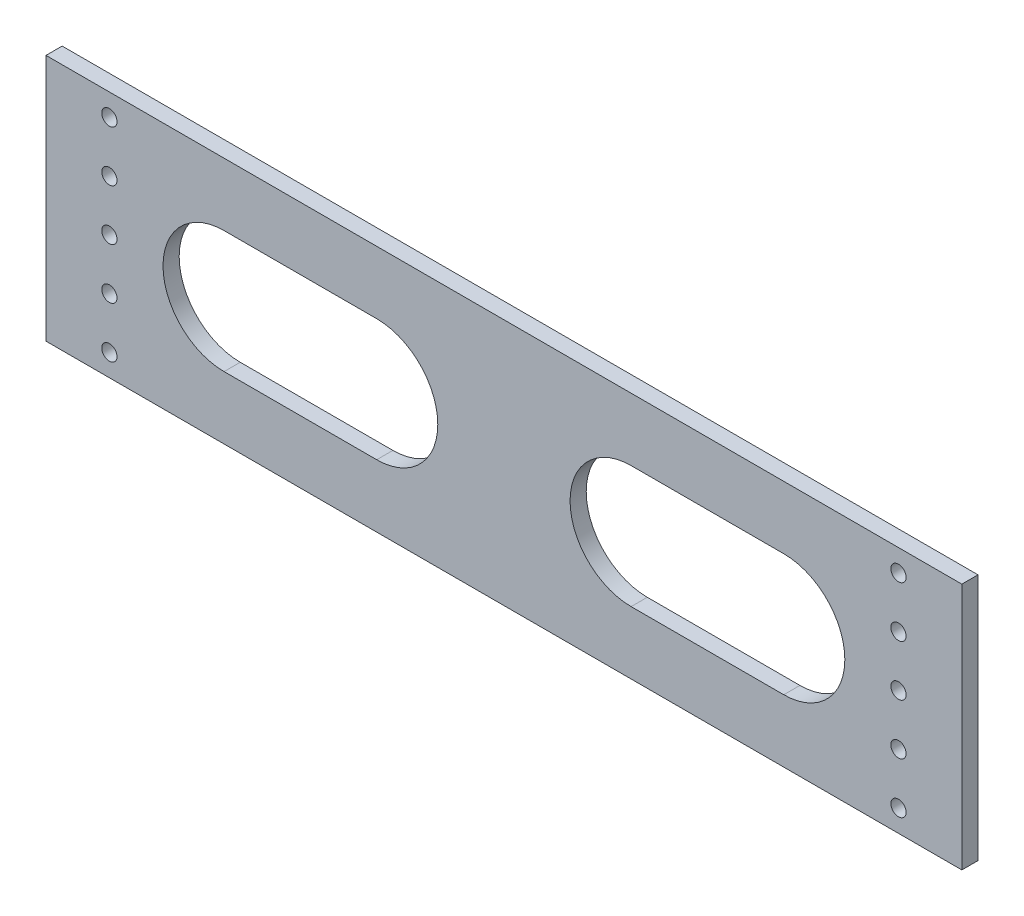
ISO-10303-21;
HEADER;
FILE_DESCRIPTION(('STEP AP214'),'2;1');
FILE_NAME('part.step','',(''),(''),'','','');
FILE_SCHEMA(('AUTOMOTIVE_DESIGN { 1 0 10303 214 1 1 1 1 }'));
ENDSEC;
DATA;
#1=APPLICATION_CONTEXT('core data for automotive mechanical design processes');
#2=APPLICATION_PROTOCOL_DEFINITION('international standard','automotive_design',2000,#1);
#3=PRODUCT_CONTEXT('',#1,'mechanical');
#4=PRODUCT('Part','Part','',(#3));
#5=PRODUCT_RELATED_PRODUCT_CATEGORY('part','',(#4));
#6=PRODUCT_DEFINITION_FORMATION('','',#4);
#7=PRODUCT_DEFINITION_CONTEXT('part definition',#1,'design');
#8=PRODUCT_DEFINITION('design','',#6,#7);
#9=PRODUCT_DEFINITION_SHAPE('','',#8);
#10=(LENGTH_UNIT() NAMED_UNIT(*) SI_UNIT(.MILLI.,.METRE.));
#11=(NAMED_UNIT(*) PLANE_ANGLE_UNIT() SI_UNIT($,.RADIAN.));
#12=(NAMED_UNIT(*) SI_UNIT($,.STERADIAN.) SOLID_ANGLE_UNIT());
#13=UNCERTAINTY_MEASURE_WITH_UNIT(LENGTH_MEASURE(1.E-05),#10,'distance_accuracy_value','');
#14=(GEOMETRIC_REPRESENTATION_CONTEXT(3) GLOBAL_UNCERTAINTY_ASSIGNED_CONTEXT((#13)) GLOBAL_UNIT_ASSIGNED_CONTEXT((#10,
#11,#12)) REPRESENTATION_CONTEXT('',''));
#15=CARTESIAN_POINT('',(0.,0.,0.));
#16=DIRECTION('',(0.,0.,1.));
#17=DIRECTION('',(1.,0.,0.));
#18=AXIS2_PLACEMENT_3D('',#15,#16,#17);
#19=CARTESIAN_POINT('',(0.,0.,3.175));
#20=DIRECTION('',(0.,0.,1.));
#21=DIRECTION('',(1.,0.,0.));
#22=AXIS2_PLACEMENT_3D('',#19,#20,#21);
#23=PLANE('',#22);
#24=CARTESIAN_POINT('',(-77.545,20.,3.175));
#25=DIRECTION('',(0.,0.,1.));
#26=DIRECTION('',(1.,0.,0.));
#27=AXIS2_PLACEMENT_3D('',#24,#25,#26);
#28=CIRCLE('',#27,1.5);
#29=CARTESIAN_POINT('',(-76.045,20.,3.175));
#30=VERTEX_POINT('',#29);
#31=EDGE_CURVE('E719',#30,#30,#28,.F.);
#32=ORIENTED_EDGE('',*,*,#31,.T.);
#33=EDGE_LOOP('',(#32));
#34=FACE_BOUND('',#33,.T.);
#35=CARTESIAN_POINT('',(-77.545,10.,3.175));
#36=DIRECTION('',(0.,0.,1.));
#37=DIRECTION('',(1.,0.,0.));
#38=AXIS2_PLACEMENT_3D('',#35,#36,#37);
#39=CIRCLE('',#38,1.5);
#40=CARTESIAN_POINT('',(-76.045,10.,3.175));
#41=VERTEX_POINT('',#40);
#42=EDGE_CURVE('E743',#41,#41,#39,.F.);
#43=ORIENTED_EDGE('',*,*,#42,.T.);
#44=EDGE_LOOP('',(#43));
#45=FACE_BOUND('',#44,.T.);
#46=CARTESIAN_POINT('',(-77.545,-20.,3.175));
#47=DIRECTION('',(0.,0.,1.));
#48=DIRECTION('',(1.,0.,0.));
#49=AXIS2_PLACEMENT_3D('',#46,#47,#48);
#50=CIRCLE('',#49,1.5);
#51=CARTESIAN_POINT('',(-76.045,-20.,3.175));
#52=VERTEX_POINT('',#51);
#53=EDGE_CURVE('E740',#52,#52,#50,.F.);
#54=ORIENTED_EDGE('',*,*,#53,.T.);
#55=EDGE_LOOP('',(#54));
#56=FACE_BOUND('',#55,.T.);
#57=CARTESIAN_POINT('',(-77.545,-10.,3.175));
#58=DIRECTION('',(0.,0.,1.));
#59=DIRECTION('',(1.,0.,0.));
#60=AXIS2_PLACEMENT_3D('',#57,#58,#59);
#61=CIRCLE('',#60,1.5);
#62=CARTESIAN_POINT('',(-76.045,-10.,3.175));
#63=VERTEX_POINT('',#62);
#64=EDGE_CURVE('E737',#63,#63,#61,.F.);
#65=ORIENTED_EDGE('',*,*,#64,.T.);
#66=EDGE_LOOP('',(#65));
#67=FACE_BOUND('',#66,.T.);
#68=CARTESIAN_POINT('',(-77.545,0.,3.175));
#69=DIRECTION('',(0.,0.,1.));
#70=DIRECTION('',(1.,0.,0.));
#71=AXIS2_PLACEMENT_3D('',#68,#69,#70);
#72=CIRCLE('',#71,1.5);
#73=CARTESIAN_POINT('',(-76.045,0.,3.175));
#74=VERTEX_POINT('',#73);
#75=EDGE_CURVE('E733',#74,#74,#72,.F.);
#76=ORIENTED_EDGE('',*,*,#75,.T.);
#77=EDGE_LOOP('',(#76));
#78=FACE_BOUND('',#77,.T.);
#79=CARTESIAN_POINT('',(77.545,-20.,3.175));
#80=DIRECTION('',(0.,0.,1.));
#81=DIRECTION('',(1.,0.,0.));
#82=AXIS2_PLACEMENT_3D('',#79,#80,#81);
#83=CIRCLE('',#82,1.5);
#84=CARTESIAN_POINT('',(79.045,-20.,3.175));
#85=VERTEX_POINT('',#84);
#86=EDGE_CURVE('E747',#85,#85,#83,.T.);
#87=ORIENTED_EDGE('',*,*,#86,.F.);
#88=EDGE_LOOP('',(#87));
#89=FACE_BOUND('',#88,.T.);
#90=CARTESIAN_POINT('',(77.545,-10.,3.175));
#91=DIRECTION('',(0.,0.,1.));
#92=DIRECTION('',(1.,0.,0.));
#93=AXIS2_PLACEMENT_3D('',#90,#91,#92);
#94=CIRCLE('',#93,1.5);
#95=CARTESIAN_POINT('',(79.045,-10.,3.175));
#96=VERTEX_POINT('',#95);
#97=EDGE_CURVE('E756',#96,#96,#94,.T.);
#98=ORIENTED_EDGE('',*,*,#97,.F.);
#99=EDGE_LOOP('',(#98));
#100=FACE_BOUND('',#99,.T.);
#101=CARTESIAN_POINT('',(77.545,20.,3.175));
#102=DIRECTION('',(0.,0.,1.));
#103=DIRECTION('',(1.,0.,0.));
#104=AXIS2_PLACEMENT_3D('',#101,#102,#103);
#105=CIRCLE('',#104,1.5);
#106=CARTESIAN_POINT('',(79.045,20.,3.175));
#107=VERTEX_POINT('',#106);
#108=EDGE_CURVE('E748',#107,#107,#105,.T.);
#109=ORIENTED_EDGE('',*,*,#108,.F.);
#110=EDGE_LOOP('',(#109));
#111=FACE_BOUND('',#110,.T.);
#112=CARTESIAN_POINT('',(77.545,10.,3.175));
#113=DIRECTION('',(0.,0.,1.));
#114=DIRECTION('',(1.,0.,0.));
#115=AXIS2_PLACEMENT_3D('',#112,#113,#114);
#116=CIRCLE('',#115,1.5);
#117=CARTESIAN_POINT('',(79.045,10.,3.175));
#118=VERTEX_POINT('',#117);
#119=EDGE_CURVE('E755',#118,#118,#116,.T.);
#120=ORIENTED_EDGE('',*,*,#119,.F.);
#121=EDGE_LOOP('',(#120));
#122=FACE_BOUND('',#121,.T.);
#123=CARTESIAN_POINT('',(77.545,0.,3.175));
#124=DIRECTION('',(0.,0.,1.));
#125=DIRECTION('',(1.,0.,0.));
#126=AXIS2_PLACEMENT_3D('',#123,#124,#125);
#127=CIRCLE('',#126,1.5);
#128=CARTESIAN_POINT('',(79.045,0.,3.175));
#129=VERTEX_POINT('',#128);
#130=EDGE_CURVE('E170',#129,#129,#127,.T.);
#131=ORIENTED_EDGE('',*,*,#130,.F.);
#132=EDGE_LOOP('',(#131));
#133=FACE_BOUND('',#132,.T.);
#134=CARTESIAN_POINT('',(-25.,0.,3.175));
#135=DIRECTION('',(0.,0.,1.));
#136=DIRECTION('',(1.,0.,0.));
#137=AXIS2_PLACEMENT_3D('',#134,#135,#136);
#138=CIRCLE('',#137,12.);
#139=CARTESIAN_POINT('',(-25.,-12.,3.175));
#140=VERTEX_POINT('',#139);
#141=CARTESIAN_POINT('',(-25.,12.,3.175));
#142=VERTEX_POINT('',#141);
#143=EDGE_CURVE('E54',#140,#142,#138,.T.);
#144=ORIENTED_EDGE('',*,*,#143,.F.);
#145=DIRECTION('',(1.,0.,0.));
#146=VECTOR('',#145,1.);
#147=CARTESIAN_POINT('',(-25.,-12.,3.175));
#148=LINE('',#147,#146);
#149=CARTESIAN_POINT('',(-55.,-12.,3.175));
#150=VERTEX_POINT('',#149);
#151=EDGE_CURVE('E151',#150,#140,#148,.T.);
#152=ORIENTED_EDGE('',*,*,#151,.F.);
#153=CARTESIAN_POINT('',(-55.,0.,3.175));
#154=DIRECTION('',(0.,0.,1.));
#155=DIRECTION('',(1.,0.,0.));
#156=AXIS2_PLACEMENT_3D('',#153,#154,#155);
#157=CIRCLE('',#156,12.);
#158=CARTESIAN_POINT('',(-55.,12.,3.175));
#159=VERTEX_POINT('',#158);
#160=EDGE_CURVE('E135',#159,#150,#157,.T.);
#161=ORIENTED_EDGE('',*,*,#160,.F.);
#162=DIRECTION('',(-1.,0.,0.));
#163=VECTOR('',#162,1.);
#164=CARTESIAN_POINT('',(-25.,12.,3.175));
#165=LINE('',#164,#163);
#166=EDGE_CURVE('E145',#142,#159,#165,.T.);
#167=ORIENTED_EDGE('',*,*,#166,.F.);
#168=EDGE_LOOP('',(#144,#152,#161,#167));
#169=FACE_BOUND('',#168,.T.);
#170=CARTESIAN_POINT('',(55.,0.,3.175));
#171=DIRECTION('',(0.,0.,1.));
#172=DIRECTION('',(1.,0.,0.));
#173=AXIS2_PLACEMENT_3D('',#170,#171,#172);
#174=CIRCLE('',#173,12.);
#175=CARTESIAN_POINT('',(55.,-12.,3.175));
#176=VERTEX_POINT('',#175);
#177=CARTESIAN_POINT('',(55.,12.,3.175));
#178=VERTEX_POINT('',#177);
#179=EDGE_CURVE('E62',#176,#178,#174,.T.);
#180=ORIENTED_EDGE('',*,*,#179,.F.);
#181=DIRECTION('',(1.,0.,0.));
#182=VECTOR('',#181,1.);
#183=CARTESIAN_POINT('',(55.,-12.,3.175));
#184=LINE('',#183,#182);
#185=CARTESIAN_POINT('',(25.,-12.,3.175));
#186=VERTEX_POINT('',#185);
#187=EDGE_CURVE('E163',#186,#176,#184,.T.);
#188=ORIENTED_EDGE('',*,*,#187,.F.);
#189=CARTESIAN_POINT('',(25.,0.,3.175));
#190=DIRECTION('',(0.,0.,1.));
#191=DIRECTION('',(1.,0.,0.));
#192=AXIS2_PLACEMENT_3D('',#189,#190,#191);
#193=CIRCLE('',#192,12.);
#194=CARTESIAN_POINT('',(25.,12.,3.175));
#195=VERTEX_POINT('',#194);
#196=EDGE_CURVE('E173',#195,#186,#193,.T.);
#197=ORIENTED_EDGE('',*,*,#196,.F.);
#198=DIRECTION('',(-1.,0.,0.));
#199=VECTOR('',#198,1.);
#200=CARTESIAN_POINT('',(55.,12.,3.175));
#201=LINE('',#200,#199);
#202=EDGE_CURVE('E176',#178,#195,#201,.T.);
#203=ORIENTED_EDGE('',*,*,#202,.F.);
#204=EDGE_LOOP('',(#180,#188,#197,#203));
#205=FACE_BOUND('',#204,.T.);
#206=DIRECTION('',(1.,0.,0.));
#207=VECTOR('',#206,1.);
#208=CARTESIAN_POINT('',(84.1375,-24.325,3.175));
#209=LINE('',#208,#207);
#210=CARTESIAN_POINT('',(-90.,-24.325,3.175));
#211=VERTEX_POINT('',#210);
#212=CARTESIAN_POINT('',(90.,-24.325,3.175));
#213=VERTEX_POINT('',#212);
#214=EDGE_CURVE('E191',#211,#213,#209,.T.);
#215=ORIENTED_EDGE('',*,*,#214,.T.);
#216=DIRECTION('',(0.,-1.,0.));
#217=VECTOR('',#216,1.);
#218=CARTESIAN_POINT('',(90.,-4.7625,3.175));
#219=LINE('',#218,#217);
#220=CARTESIAN_POINT('',(90.,24.325,3.175));
#221=VERTEX_POINT('',#220);
#222=EDGE_CURVE('E199',#221,#213,#219,.T.);
#223=ORIENTED_EDGE('',*,*,#222,.F.);
#224=DIRECTION('',(1.,0.,0.));
#225=VECTOR('',#224,1.);
#226=CARTESIAN_POINT('',(1.58750000000001,24.325,3.175));
#227=LINE('',#226,#225);
#228=CARTESIAN_POINT('',(-90.,24.325,3.175));
#229=VERTEX_POINT('',#228);
#230=EDGE_CURVE('E194',#229,#221,#227,.T.);
#231=ORIENTED_EDGE('',*,*,#230,.F.);
#232=DIRECTION('',(0.,-1.,0.));
#233=VECTOR('',#232,1.);
#234=CARTESIAN_POINT('',(-90.,14.2875,3.175));
#235=LINE('',#234,#233);
#236=EDGE_CURVE('E197',#229,#211,#235,.T.);
#237=ORIENTED_EDGE('',*,*,#236,.T.);
#238=EDGE_LOOP('',(#215,#223,#231,#237));
#239=FACE_BOUND('',#238,.T.);
#240=ADVANCED_FACE('F39',(#34,#45,#56,#67,#78,#89,#100,#111,#122,#133,#169,#205,#239),#23,.T.);
#241=CARTESIAN_POINT('',(0.,0.,0.));
#242=DIRECTION('',(0.,0.,1.));
#243=DIRECTION('',(1.,0.,0.));
#244=AXIS2_PLACEMENT_3D('',#241,#242,#243);
#245=PLANE('',#244);
#246=CARTESIAN_POINT('',(-77.545,20.,0.));
#247=DIRECTION('',(0.,0.,1.));
#248=DIRECTION('',(1.,0.,0.));
#249=AXIS2_PLACEMENT_3D('',#246,#247,#248);
#250=CIRCLE('',#249,1.5);
#251=CARTESIAN_POINT('',(-76.045,20.,0.));
#252=VERTEX_POINT('',#251);
#253=EDGE_CURVE('E722',#252,#252,#250,.T.);
#254=ORIENTED_EDGE('',*,*,#253,.T.);
#255=EDGE_LOOP('',(#254));
#256=FACE_BOUND('',#255,.T.);
#257=CARTESIAN_POINT('',(-77.545,10.,0.));
#258=DIRECTION('',(0.,0.,1.));
#259=DIRECTION('',(1.,0.,0.));
#260=AXIS2_PLACEMENT_3D('',#257,#258,#259);
#261=CIRCLE('',#260,1.5);
#262=CARTESIAN_POINT('',(-76.045,10.,0.));
#263=VERTEX_POINT('',#262);
#264=EDGE_CURVE('E723',#263,#263,#261,.T.);
#265=ORIENTED_EDGE('',*,*,#264,.T.);
#266=EDGE_LOOP('',(#265));
#267=FACE_BOUND('',#266,.T.);
#268=CARTESIAN_POINT('',(-77.545,-20.,0.));
#269=DIRECTION('',(0.,0.,1.));
#270=DIRECTION('',(1.,0.,0.));
#271=AXIS2_PLACEMENT_3D('',#268,#269,#270);
#272=CIRCLE('',#271,1.5);
#273=CARTESIAN_POINT('',(-76.045,-20.,0.));
#274=VERTEX_POINT('',#273);
#275=EDGE_CURVE('E726',#274,#274,#272,.T.);
#276=ORIENTED_EDGE('',*,*,#275,.T.);
#277=EDGE_LOOP('',(#276));
#278=FACE_BOUND('',#277,.T.);
#279=CARTESIAN_POINT('',(-77.545,-10.,0.));
#280=DIRECTION('',(0.,0.,1.));
#281=DIRECTION('',(1.,0.,0.));
#282=AXIS2_PLACEMENT_3D('',#279,#280,#281);
#283=CIRCLE('',#282,1.5);
#284=CARTESIAN_POINT('',(-76.045,-10.,0.));
#285=VERTEX_POINT('',#284);
#286=EDGE_CURVE('E734',#285,#285,#283,.T.);
#287=ORIENTED_EDGE('',*,*,#286,.T.);
#288=EDGE_LOOP('',(#287));
#289=FACE_BOUND('',#288,.T.);
#290=CARTESIAN_POINT('',(-77.545,0.,0.));
#291=DIRECTION('',(0.,0.,1.));
#292=DIRECTION('',(1.,0.,0.));
#293=AXIS2_PLACEMENT_3D('',#290,#291,#292);
#294=CIRCLE('',#293,1.5);
#295=CARTESIAN_POINT('',(-76.045,0.,0.));
#296=VERTEX_POINT('',#295);
#297=EDGE_CURVE('E730',#296,#296,#294,.T.);
#298=ORIENTED_EDGE('',*,*,#297,.T.);
#299=EDGE_LOOP('',(#298));
#300=FACE_BOUND('',#299,.T.);
#301=CARTESIAN_POINT('',(77.545,-20.,0.));
#302=DIRECTION('',(0.,0.,-1.));
#303=DIRECTION('',(-1.,0.,0.));
#304=AXIS2_PLACEMENT_3D('',#301,#302,#303);
#305=CIRCLE('',#304,1.5);
#306=CARTESIAN_POINT('',(76.045,-20.,0.));
#307=VERTEX_POINT('',#306);
#308=EDGE_CURVE('E759',#307,#307,#305,.T.);
#309=ORIENTED_EDGE('',*,*,#308,.F.);
#310=EDGE_LOOP('',(#309));
#311=FACE_BOUND('',#310,.T.);
#312=CARTESIAN_POINT('',(77.545,-10.,0.));
#313=DIRECTION('',(0.,0.,-1.));
#314=DIRECTION('',(-1.,0.,0.));
#315=AXIS2_PLACEMENT_3D('',#312,#313,#314);
#316=CIRCLE('',#315,1.5);
#317=CARTESIAN_POINT('',(76.045,-10.,0.));
#318=VERTEX_POINT('',#317);
#319=EDGE_CURVE('E752',#318,#318,#316,.T.);
#320=ORIENTED_EDGE('',*,*,#319,.F.);
#321=EDGE_LOOP('',(#320));
#322=FACE_BOUND('',#321,.T.);
#323=CARTESIAN_POINT('',(77.545,20.,0.));
#324=DIRECTION('',(0.,0.,-1.));
#325=DIRECTION('',(-1.,0.,0.));
#326=AXIS2_PLACEMENT_3D('',#323,#324,#325);
#327=CIRCLE('',#326,1.5);
#328=CARTESIAN_POINT('',(76.045,20.,0.));
#329=VERTEX_POINT('',#328);
#330=EDGE_CURVE('E751',#329,#329,#327,.T.);
#331=ORIENTED_EDGE('',*,*,#330,.F.);
#332=EDGE_LOOP('',(#331));
#333=FACE_BOUND('',#332,.T.);
#334=CARTESIAN_POINT('',(77.545,10.,0.));
#335=DIRECTION('',(0.,0.,-1.));
#336=DIRECTION('',(-1.,0.,0.));
#337=AXIS2_PLACEMENT_3D('',#334,#335,#336);
#338=CIRCLE('',#337,1.5);
#339=CARTESIAN_POINT('',(76.045,10.,0.));
#340=VERTEX_POINT('',#339);
#341=EDGE_CURVE('E768',#340,#340,#338,.T.);
#342=ORIENTED_EDGE('',*,*,#341,.F.);
#343=EDGE_LOOP('',(#342));
#344=FACE_BOUND('',#343,.T.);
#345=CARTESIAN_POINT('',(77.545,0.,0.));
#346=DIRECTION('',(0.,0.,-1.));
#347=DIRECTION('',(-1.,0.,0.));
#348=AXIS2_PLACEMENT_3D('',#345,#346,#347);
#349=CIRCLE('',#348,1.5);
#350=CARTESIAN_POINT('',(76.045,0.,0.));
#351=VERTEX_POINT('',#350);
#352=EDGE_CURVE('E771',#351,#351,#349,.T.);
#353=ORIENTED_EDGE('',*,*,#352,.F.);
#354=EDGE_LOOP('',(#353));
#355=FACE_BOUND('',#354,.T.);
#356=DIRECTION('',(1.,0.,0.));
#357=VECTOR('',#356,1.);
#358=CARTESIAN_POINT('',(0.,-12.,0.));
#359=LINE('',#358,#357);
#360=CARTESIAN_POINT('',(-55.,-12.,0.));
#361=VERTEX_POINT('',#360);
#362=CARTESIAN_POINT('',(-25.,-12.,0.));
#363=VERTEX_POINT('',#362);
#364=EDGE_CURVE('E47',#361,#363,#359,.T.);
#365=ORIENTED_EDGE('',*,*,#364,.T.);
#366=CARTESIAN_POINT('',(-25.,0.,0.));
#367=DIRECTION('',(0.,0.,1.));
#368=DIRECTION('',(1.,0.,0.));
#369=AXIS2_PLACEMENT_3D('',#366,#367,#368);
#370=CIRCLE('',#369,12.);
#371=CARTESIAN_POINT('',(-25.,12.,0.));
#372=VERTEX_POINT('',#371);
#373=EDGE_CURVE('E11',#363,#372,#370,.T.);
#374=ORIENTED_EDGE('',*,*,#373,.T.);
#375=DIRECTION('',(-1.,0.,0.));
#376=VECTOR('',#375,1.);
#377=CARTESIAN_POINT('',(0.,12.,0.));
#378=LINE('',#377,#376);
#379=CARTESIAN_POINT('',(-55.,12.,0.));
#380=VERTEX_POINT('',#379);
#381=EDGE_CURVE('E223',#372,#380,#378,.T.);
#382=ORIENTED_EDGE('',*,*,#381,.T.);
#383=CARTESIAN_POINT('',(-55.,0.,0.));
#384=DIRECTION('',(0.,0.,1.));
#385=DIRECTION('',(1.,0.,0.));
#386=AXIS2_PLACEMENT_3D('',#383,#384,#385);
#387=CIRCLE('',#386,12.);
#388=EDGE_CURVE('E138',#380,#361,#387,.T.);
#389=ORIENTED_EDGE('',*,*,#388,.T.);
#390=EDGE_LOOP('',(#365,#374,#382,#389));
#391=FACE_BOUND('',#390,.T.);
#392=DIRECTION('',(1.,0.,0.));
#393=VECTOR('',#392,1.);
#394=CARTESIAN_POINT('',(0.,-12.,0.));
#395=LINE('',#394,#393);
#396=CARTESIAN_POINT('',(25.,-12.,0.));
#397=VERTEX_POINT('',#396);
#398=CARTESIAN_POINT('',(55.,-12.,0.));
#399=VERTEX_POINT('',#398);
#400=EDGE_CURVE('E217',#397,#399,#395,.T.);
#401=ORIENTED_EDGE('',*,*,#400,.T.);
#402=CARTESIAN_POINT('',(55.,0.,0.));
#403=DIRECTION('',(0.,0.,1.));
#404=DIRECTION('',(1.,0.,0.));
#405=AXIS2_PLACEMENT_3D('',#402,#403,#404);
#406=CIRCLE('',#405,12.);
#407=CARTESIAN_POINT('',(55.,12.,0.));
#408=VERTEX_POINT('',#407);
#409=EDGE_CURVE('E220',#399,#408,#406,.T.);
#410=ORIENTED_EDGE('',*,*,#409,.T.);
#411=DIRECTION('',(-1.,0.,0.));
#412=VECTOR('',#411,1.);
#413=CARTESIAN_POINT('',(0.,12.,0.));
#414=LINE('',#413,#412);
#415=CARTESIAN_POINT('',(25.,12.,0.));
#416=VERTEX_POINT('',#415);
#417=EDGE_CURVE('E211',#408,#416,#414,.T.);
#418=ORIENTED_EDGE('',*,*,#417,.T.);
#419=CARTESIAN_POINT('',(25.,0.,0.));
#420=DIRECTION('',(0.,0.,1.));
#421=DIRECTION('',(1.,0.,0.));
#422=AXIS2_PLACEMENT_3D('',#419,#420,#421);
#423=CIRCLE('',#422,12.);
#424=EDGE_CURVE('E214',#416,#397,#423,.T.);
#425=ORIENTED_EDGE('',*,*,#424,.T.);
#426=EDGE_LOOP('',(#401,#410,#418,#425));
#427=FACE_BOUND('',#426,.T.);
#428=DIRECTION('',(0.,-1.,0.));
#429=VECTOR('',#428,1.);
#430=CARTESIAN_POINT('',(90.,0.,0.));
#431=LINE('',#430,#429);
#432=CARTESIAN_POINT('',(90.,24.325,0.));
#433=VERTEX_POINT('',#432);
#434=CARTESIAN_POINT('',(90.,-24.325,0.));
#435=VERTEX_POINT('',#434);
#436=EDGE_CURVE('E201',#433,#435,#431,.T.);
#437=ORIENTED_EDGE('',*,*,#436,.T.);
#438=DIRECTION('',(1.,0.,0.));
#439=VECTOR('',#438,1.);
#440=CARTESIAN_POINT('',(0.,-24.325,0.));
#441=LINE('',#440,#439);
#442=CARTESIAN_POINT('',(-90.,-24.325,0.));
#443=VERTEX_POINT('',#442);
#444=EDGE_CURVE('E208',#443,#435,#441,.T.);
#445=ORIENTED_EDGE('',*,*,#444,.F.);
#446=DIRECTION('',(0.,-1.,0.));
#447=VECTOR('',#446,1.);
#448=CARTESIAN_POINT('',(-90.,0.,0.));
#449=LINE('',#448,#447);
#450=CARTESIAN_POINT('',(-90.,24.325,0.));
#451=VERTEX_POINT('',#450);
#452=EDGE_CURVE('E203',#451,#443,#449,.T.);
#453=ORIENTED_EDGE('',*,*,#452,.F.);
#454=DIRECTION('',(1.,0.,0.));
#455=VECTOR('',#454,1.);
#456=CARTESIAN_POINT('',(0.,24.325,0.));
#457=LINE('',#456,#455);
#458=EDGE_CURVE('E205',#451,#433,#457,.T.);
#459=ORIENTED_EDGE('',*,*,#458,.T.);
#460=EDGE_LOOP('',(#437,#445,#453,#459));
#461=FACE_BOUND('',#460,.T.);
#462=ADVANCED_FACE('F41',(#256,#267,#278,#289,#300,#311,#322,#333,#344,#355,#391,#427,#461),
#245,.F.);
#463=CARTESIAN_POINT('',(90.,-4.7625,-6.825));
#464=DIRECTION('',(-1.,0.,0.));
#465=DIRECTION('',(0.,0.,1.));
#466=AXIS2_PLACEMENT_3D('',#463,#464,#465);
#467=PLANE('',#466);
#468=ORIENTED_EDGE('',*,*,#436,.F.);
#469=DIRECTION('',(0.,0.,1.));
#470=VECTOR('',#469,1.);
#471=CARTESIAN_POINT('',(90.,24.325,-6.825));
#472=LINE('',#471,#470);
#473=EDGE_CURVE('E185',#433,#221,#472,.T.);
#474=ORIENTED_EDGE('',*,*,#473,.T.);
#475=ORIENTED_EDGE('',*,*,#222,.T.);
#476=DIRECTION('',(0.,0.,-1.));
#477=VECTOR('',#476,1.);
#478=CARTESIAN_POINT('',(90.,-24.325,-6.825));
#479=LINE('',#478,#477);
#480=EDGE_CURVE('E158',#213,#435,#479,.T.);
#481=ORIENTED_EDGE('',*,*,#480,.T.);
#482=EDGE_LOOP('',(#468,#474,#475,#481));
#483=FACE_BOUND('',#482,.T.);
#484=ADVANCED_FACE('F251',(#483),#467,.F.);
#485=CARTESIAN_POINT('',(-90.,20.6375,-6.825));
#486=DIRECTION('',(-1.,0.,0.));
#487=DIRECTION('',(0.,0.,1.));
#488=AXIS2_PLACEMENT_3D('',#485,#486,#487);
#489=PLANE('',#488);
#490=DIRECTION('',(0.,0.,1.));
#491=VECTOR('',#490,1.);
#492=CARTESIAN_POINT('',(-90.,24.325,-6.825));
#493=LINE('',#492,#491);
#494=EDGE_CURVE('E188',#451,#229,#493,.T.);
#495=ORIENTED_EDGE('',*,*,#494,.F.);
#496=ORIENTED_EDGE('',*,*,#452,.T.);
#497=DIRECTION('',(0.,0.,-1.));
#498=VECTOR('',#497,1.);
#499=CARTESIAN_POINT('',(-90.,-24.325,-6.825));
#500=LINE('',#499,#498);
#501=EDGE_CURVE('E182',#211,#443,#500,.T.);
#502=ORIENTED_EDGE('',*,*,#501,.F.);
#503=ORIENTED_EDGE('',*,*,#236,.F.);
#504=EDGE_LOOP('',(#495,#496,#502,#503));
#505=FACE_BOUND('',#504,.T.);
#506=ADVANCED_FACE('F258',(#505),#489,.T.);
#507=CARTESIAN_POINT('',(1.58750000000001,24.325,-6.825));
#508=DIRECTION('',(0.,-1.,0.));
#509=DIRECTION('',(0.,0.,-1.));
#510=AXIS2_PLACEMENT_3D('',#507,#508,#509);
#511=PLANE('',#510);
#512=ORIENTED_EDGE('',*,*,#458,.F.);
#513=ORIENTED_EDGE('',*,*,#494,.T.);
#514=ORIENTED_EDGE('',*,*,#230,.T.);
#515=ORIENTED_EDGE('',*,*,#473,.F.);
#516=EDGE_LOOP('',(#512,#513,#514,#515));
#517=FACE_BOUND('',#516,.T.);
#518=ADVANCED_FACE('F261',(#517),#511,.F.);
#519=CARTESIAN_POINT('',(84.1375,-24.325,-6.825));
#520=DIRECTION('',(0.,-1.,0.));
#521=DIRECTION('',(0.,0.,-1.));
#522=AXIS2_PLACEMENT_3D('',#519,#520,#521);
#523=PLANE('',#522);
#524=ORIENTED_EDGE('',*,*,#444,.T.);
#525=ORIENTED_EDGE('',*,*,#480,.F.);
#526=ORIENTED_EDGE('',*,*,#214,.F.);
#527=ORIENTED_EDGE('',*,*,#501,.T.);
#528=EDGE_LOOP('',(#524,#525,#526,#527));
#529=FACE_BOUND('',#528,.T.);
#530=ADVANCED_FACE('F265',(#529),#523,.T.);
#531=CARTESIAN_POINT('',(55.,0.,-6.825));
#532=DIRECTION('',(0.,0.,1.));
#533=DIRECTION('',(1.,0.,0.));
#534=AXIS2_PLACEMENT_3D('',#531,#532,#533);
#535=CYLINDRICAL_SURFACE('',#534,12.);
#536=DIRECTION('',(0.,0.,1.));
#537=VECTOR('',#536,1.);
#538=CARTESIAN_POINT('',(55.,-12.,-6.825));
#539=LINE('',#538,#537);
#540=EDGE_CURVE('E168',#399,#176,#539,.T.);
#541=ORIENTED_EDGE('',*,*,#540,.T.);
#542=ORIENTED_EDGE('',*,*,#179,.T.);
#543=DIRECTION('',(0.,0.,1.));
#544=VECTOR('',#543,1.);
#545=CARTESIAN_POINT('',(55.,12.,-6.825));
#546=LINE('',#545,#544);
#547=EDGE_CURVE('E161',#408,#178,#546,.T.);
#548=ORIENTED_EDGE('',*,*,#547,.F.);
#549=ORIENTED_EDGE('',*,*,#409,.F.);
#550=EDGE_LOOP('',(#541,#542,#548,#549));
#551=FACE_BOUND('',#550,.T.);
#552=ADVANCED_FACE('F269',(#551),#535,.F.);
#553=CARTESIAN_POINT('',(55.,-12.,-6.825));
#554=DIRECTION('',(0.,-1.,0.));
#555=DIRECTION('',(1.,0.,0.));
#556=AXIS2_PLACEMENT_3D('',#553,#554,#555);
#557=PLANE('',#556);
#558=DIRECTION('',(0.,0.,1.));
#559=VECTOR('',#558,1.);
#560=CARTESIAN_POINT('',(25.,-12.,-6.825));
#561=LINE('',#560,#559);
#562=EDGE_CURVE('E166',#397,#186,#561,.T.);
#563=ORIENTED_EDGE('',*,*,#562,.T.);
#564=ORIENTED_EDGE('',*,*,#187,.T.);
#565=ORIENTED_EDGE('',*,*,#540,.F.);
#566=ORIENTED_EDGE('',*,*,#400,.F.);
#567=EDGE_LOOP('',(#563,#564,#565,#566));
#568=FACE_BOUND('',#567,.T.);
#569=ADVANCED_FACE('F271',(#568),#557,.F.);
#570=CARTESIAN_POINT('',(25.,0.,-6.825));
#571=DIRECTION('',(0.,0.,1.));
#572=DIRECTION('',(1.,0.,0.));
#573=AXIS2_PLACEMENT_3D('',#570,#571,#572);
#574=CYLINDRICAL_SURFACE('',#573,12.);
#575=DIRECTION('',(0.,0.,1.));
#576=VECTOR('',#575,1.);
#577=CARTESIAN_POINT('',(25.,12.,-6.825));
#578=LINE('',#577,#576);
#579=EDGE_CURVE('E164',#416,#195,#578,.T.);
#580=ORIENTED_EDGE('',*,*,#579,.T.);
#581=ORIENTED_EDGE('',*,*,#196,.T.);
#582=ORIENTED_EDGE('',*,*,#562,.F.);
#583=ORIENTED_EDGE('',*,*,#424,.F.);
#584=EDGE_LOOP('',(#580,#581,#582,#583));
#585=FACE_BOUND('',#584,.T.);
#586=ADVANCED_FACE('F240',(#585),#574,.F.);
#587=CARTESIAN_POINT('',(55.,12.,-6.825));
#588=DIRECTION('',(0.,1.,0.));
#589=DIRECTION('',(-1.,0.,0.));
#590=AXIS2_PLACEMENT_3D('',#587,#588,#589);
#591=PLANE('',#590);
#592=ORIENTED_EDGE('',*,*,#547,.T.);
#593=ORIENTED_EDGE('',*,*,#202,.T.);
#594=ORIENTED_EDGE('',*,*,#579,.F.);
#595=ORIENTED_EDGE('',*,*,#417,.F.);
#596=EDGE_LOOP('',(#592,#593,#594,#595));
#597=FACE_BOUND('',#596,.T.);
#598=ADVANCED_FACE('F233',(#597),#591,.F.);
#599=CARTESIAN_POINT('',(-25.,0.,-6.825));
#600=DIRECTION('',(0.,0.,1.));
#601=DIRECTION('',(1.,0.,0.));
#602=AXIS2_PLACEMENT_3D('',#599,#600,#601);
#603=CYLINDRICAL_SURFACE('',#602,12.);
#604=DIRECTION('',(0.,0.,1.));
#605=VECTOR('',#604,1.);
#606=CARTESIAN_POINT('',(-25.,-12.,-6.825));
#607=LINE('',#606,#605);
#608=EDGE_CURVE('E156',#363,#140,#607,.T.);
#609=ORIENTED_EDGE('',*,*,#608,.T.);
#610=ORIENTED_EDGE('',*,*,#143,.T.);
#611=DIRECTION('',(0.,0.,1.));
#612=VECTOR('',#611,1.);
#613=CARTESIAN_POINT('',(-25.,12.,-6.825));
#614=LINE('',#613,#612);
#615=EDGE_CURVE('E142',#372,#142,#614,.T.);
#616=ORIENTED_EDGE('',*,*,#615,.F.);
#617=ORIENTED_EDGE('',*,*,#373,.F.);
#618=EDGE_LOOP('',(#609,#610,#616,#617));
#619=FACE_BOUND('',#618,.T.);
#620=ADVANCED_FACE('F231',(#619),#603,.F.);
#621=CARTESIAN_POINT('',(-25.,-12.,-6.825));
#622=DIRECTION('',(0.,-1.,0.));
#623=DIRECTION('',(1.,0.,0.));
#624=AXIS2_PLACEMENT_3D('',#621,#622,#623);
#625=PLANE('',#624);
#626=DIRECTION('',(0.,0.,1.));
#627=VECTOR('',#626,1.);
#628=CARTESIAN_POINT('',(-55.,-12.,-6.825));
#629=LINE('',#628,#627);
#630=EDGE_CURVE('E141',#361,#150,#629,.T.);
#631=ORIENTED_EDGE('',*,*,#630,.T.);
#632=ORIENTED_EDGE('',*,*,#151,.T.);
#633=ORIENTED_EDGE('',*,*,#608,.F.);
#634=ORIENTED_EDGE('',*,*,#364,.F.);
#635=EDGE_LOOP('',(#631,#632,#633,#634));
#636=FACE_BOUND('',#635,.T.);
#637=ADVANCED_FACE('F230',(#636),#625,.F.);
#638=CARTESIAN_POINT('',(-55.,0.,-6.825));
#639=DIRECTION('',(0.,0.,1.));
#640=DIRECTION('',(1.,0.,0.));
#641=AXIS2_PLACEMENT_3D('',#638,#639,#640);
#642=CYLINDRICAL_SURFACE('',#641,12.);
#643=DIRECTION('',(0.,0.,1.));
#644=VECTOR('',#643,1.);
#645=CARTESIAN_POINT('',(-55.,12.,-6.825));
#646=LINE('',#645,#644);
#647=EDGE_CURVE('E130',#380,#159,#646,.T.);
#648=ORIENTED_EDGE('',*,*,#647,.T.);
#649=ORIENTED_EDGE('',*,*,#160,.T.);
#650=ORIENTED_EDGE('',*,*,#630,.F.);
#651=ORIENTED_EDGE('',*,*,#388,.F.);
#652=EDGE_LOOP('',(#648,#649,#650,#651));
#653=FACE_BOUND('',#652,.T.);
#654=ADVANCED_FACE('F132',(#653),#642,.F.);
#655=CARTESIAN_POINT('',(-25.,12.,-6.825));
#656=DIRECTION('',(0.,1.,0.));
#657=DIRECTION('',(-1.,0.,0.));
#658=AXIS2_PLACEMENT_3D('',#655,#656,#657);
#659=PLANE('',#658);
#660=ORIENTED_EDGE('',*,*,#615,.T.);
#661=ORIENTED_EDGE('',*,*,#166,.T.);
#662=ORIENTED_EDGE('',*,*,#647,.F.);
#663=ORIENTED_EDGE('',*,*,#381,.F.);
#664=EDGE_LOOP('',(#660,#661,#662,#663));
#665=FACE_BOUND('',#664,.T.);
#666=ADVANCED_FACE('F146',(#665),#659,.F.);
#667=CARTESIAN_POINT('',(77.545,0.,10.));
#668=DIRECTION('',(0.,0.,-1.));
#669=DIRECTION('',(-1.,0.,0.));
#670=AXIS2_PLACEMENT_3D('',#667,#668,#669);
#671=CYLINDRICAL_SURFACE('',#670,1.5);
#672=ORIENTED_EDGE('',*,*,#130,.T.);
#673=EDGE_LOOP('',(#672));
#674=FACE_BOUND('',#673,.T.);
#675=ORIENTED_EDGE('',*,*,#352,.T.);
#676=EDGE_LOOP('',(#675));
#677=FACE_BOUND('',#676,.T.);
#678=ADVANCED_FACE('F340',(#674,#677),#671,.F.);
#679=CARTESIAN_POINT('',(77.545,10.,10.));
#680=DIRECTION('',(0.,0.,-1.));
#681=DIRECTION('',(-1.,0.,0.));
#682=AXIS2_PLACEMENT_3D('',#679,#680,#681);
#683=CYLINDRICAL_SURFACE('',#682,1.5);
#684=ORIENTED_EDGE('',*,*,#119,.T.);
#685=EDGE_LOOP('',(#684));
#686=FACE_BOUND('',#685,.T.);
#687=ORIENTED_EDGE('',*,*,#341,.T.);
#688=EDGE_LOOP('',(#687));
#689=FACE_BOUND('',#688,.T.);
#690=ADVANCED_FACE('F348',(#686,#689),#683,.F.);
#691=CARTESIAN_POINT('',(77.545,20.,10.));
#692=DIRECTION('',(0.,0.,-1.));
#693=DIRECTION('',(-1.,0.,0.));
#694=AXIS2_PLACEMENT_3D('',#691,#692,#693);
#695=CYLINDRICAL_SURFACE('',#694,1.5);
#696=ORIENTED_EDGE('',*,*,#108,.T.);
#697=EDGE_LOOP('',(#696));
#698=FACE_BOUND('',#697,.T.);
#699=ORIENTED_EDGE('',*,*,#330,.T.);
#700=EDGE_LOOP('',(#699));
#701=FACE_BOUND('',#700,.T.);
#702=ADVANCED_FACE('F359',(#698,#701),#695,.F.);
#703=CARTESIAN_POINT('',(77.545,-10.,10.));
#704=DIRECTION('',(0.,0.,-1.));
#705=DIRECTION('',(-1.,0.,0.));
#706=AXIS2_PLACEMENT_3D('',#703,#704,#705);
#707=CYLINDRICAL_SURFACE('',#706,1.5);
#708=ORIENTED_EDGE('',*,*,#97,.T.);
#709=EDGE_LOOP('',(#708));
#710=FACE_BOUND('',#709,.T.);
#711=ORIENTED_EDGE('',*,*,#319,.T.);
#712=EDGE_LOOP('',(#711));
#713=FACE_BOUND('',#712,.T.);
#714=ADVANCED_FACE('F370',(#710,#713),#707,.F.);
#715=CARTESIAN_POINT('',(77.545,-20.,10.));
#716=DIRECTION('',(0.,0.,-1.));
#717=DIRECTION('',(-1.,0.,0.));
#718=AXIS2_PLACEMENT_3D('',#715,#716,#717);
#719=CYLINDRICAL_SURFACE('',#718,1.5);
#720=ORIENTED_EDGE('',*,*,#86,.T.);
#721=EDGE_LOOP('',(#720));
#722=FACE_BOUND('',#721,.T.);
#723=ORIENTED_EDGE('',*,*,#308,.T.);
#724=EDGE_LOOP('',(#723));
#725=FACE_BOUND('',#724,.T.);
#726=ADVANCED_FACE('F380',(#722,#725),#719,.F.);
#727=CARTESIAN_POINT('',(-77.545,0.,10.));
#728=DIRECTION('',(0.,0.,-1.));
#729=DIRECTION('',(-1.,0.,0.));
#730=AXIS2_PLACEMENT_3D('',#727,#728,#729);
#731=CYLINDRICAL_SURFACE('',#730,1.5);
#732=ORIENTED_EDGE('',*,*,#75,.F.);
#733=EDGE_LOOP('',(#732));
#734=FACE_BOUND('',#733,.T.);
#735=ORIENTED_EDGE('',*,*,#297,.F.);
#736=EDGE_LOOP('',(#735));
#737=FACE_BOUND('',#736,.T.);
#738=ADVANCED_FACE('F389',(#734,#737),#731,.F.);
#739=CARTESIAN_POINT('',(-77.545,-10.,10.));
#740=DIRECTION('',(0.,0.,-1.));
#741=DIRECTION('',(-1.,0.,0.));
#742=AXIS2_PLACEMENT_3D('',#739,#740,#741);
#743=CYLINDRICAL_SURFACE('',#742,1.5);
#744=ORIENTED_EDGE('',*,*,#64,.F.);
#745=EDGE_LOOP('',(#744));
#746=FACE_BOUND('',#745,.T.);
#747=ORIENTED_EDGE('',*,*,#286,.F.);
#748=EDGE_LOOP('',(#747));
#749=FACE_BOUND('',#748,.T.);
#750=ADVANCED_FACE('F398',(#746,#749),#743,.F.);
#751=CARTESIAN_POINT('',(-77.545,-20.,10.));
#752=DIRECTION('',(0.,0.,-1.));
#753=DIRECTION('',(-1.,0.,0.));
#754=AXIS2_PLACEMENT_3D('',#751,#752,#753);
#755=CYLINDRICAL_SURFACE('',#754,1.5);
#756=ORIENTED_EDGE('',*,*,#53,.F.);
#757=EDGE_LOOP('',(#756));
#758=FACE_BOUND('',#757,.T.);
#759=ORIENTED_EDGE('',*,*,#275,.F.);
#760=EDGE_LOOP('',(#759));
#761=FACE_BOUND('',#760,.T.);
#762=ADVANCED_FACE('F408',(#758,#761),#755,.F.);
#763=CARTESIAN_POINT('',(-77.545,10.,10.));
#764=DIRECTION('',(0.,0.,-1.));
#765=DIRECTION('',(-1.,0.,0.));
#766=AXIS2_PLACEMENT_3D('',#763,#764,#765);
#767=CYLINDRICAL_SURFACE('',#766,1.5);
#768=ORIENTED_EDGE('',*,*,#42,.F.);
#769=EDGE_LOOP('',(#768));
#770=FACE_BOUND('',#769,.T.);
#771=ORIENTED_EDGE('',*,*,#264,.F.);
#772=EDGE_LOOP('',(#771));
#773=FACE_BOUND('',#772,.T.);
#774=ADVANCED_FACE('F418',(#770,#773),#767,.F.);
#775=CARTESIAN_POINT('',(-77.545,20.,10.));
#776=DIRECTION('',(0.,0.,-1.));
#777=DIRECTION('',(-1.,0.,0.));
#778=AXIS2_PLACEMENT_3D('',#775,#776,#777);
#779=CYLINDRICAL_SURFACE('',#778,1.5);
#780=ORIENTED_EDGE('',*,*,#31,.F.);
#781=EDGE_LOOP('',(#780));
#782=FACE_BOUND('',#781,.T.);
#783=ORIENTED_EDGE('',*,*,#253,.F.);
#784=EDGE_LOOP('',(#783));
#785=FACE_BOUND('',#784,.T.);
#786=ADVANCED_FACE('F428',(#782,#785),#779,.F.);
#787=CLOSED_SHELL('',(#240,#462,#484,#506,#518,#530,#552,#569,#586,#598,#620,#637,#654,#666,
#678,#690,#702,#714,#726,#738,#750,#762,#774,#786));
#788=MANIFOLD_SOLID_BREP('B2',#787);
#789=ADVANCED_BREP_SHAPE_REPRESENTATION('',(#18,#788),#14);
#790=SHAPE_DEFINITION_REPRESENTATION(#9,#789);
ENDSEC;
END-ISO-10303-21;
